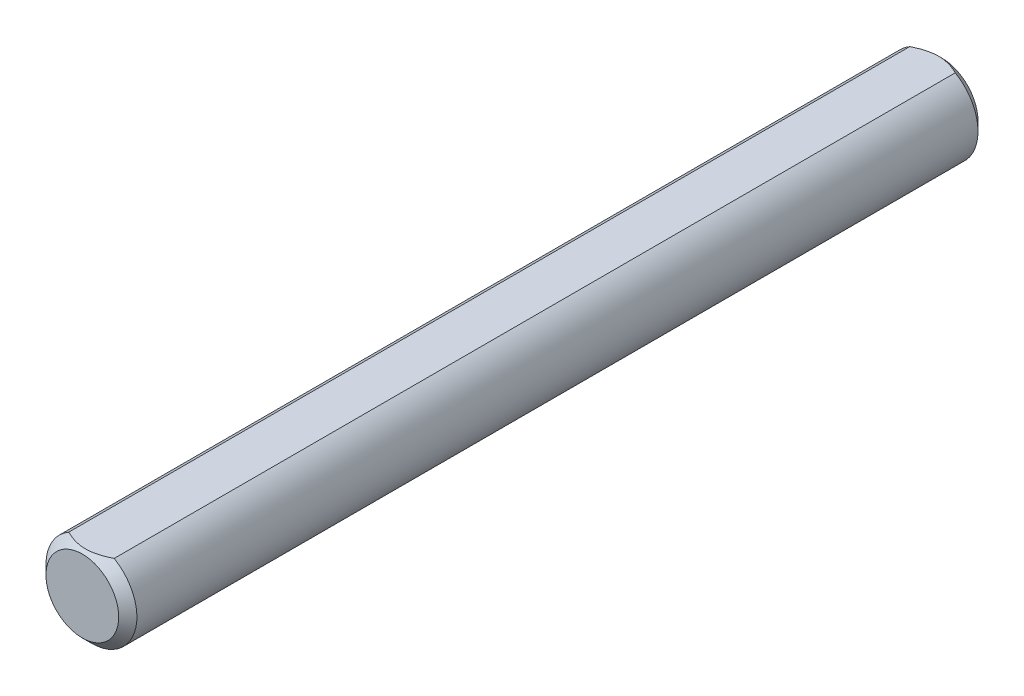
ISO-10303-21;
HEADER;
FILE_DESCRIPTION(('STEP AP214'),'2;1');
FILE_NAME('part.step','',(''),(''),'','','');
FILE_SCHEMA(('AUTOMOTIVE_DESIGN { 1 0 10303 214 1 1 1 1 }'));
ENDSEC;
DATA;
#1=APPLICATION_CONTEXT('core data for automotive mechanical design processes');
#2=APPLICATION_PROTOCOL_DEFINITION('international standard','automotive_design',2000,#1);
#3=PRODUCT_CONTEXT('',#1,'mechanical');
#4=PRODUCT('Part','Part','',(#3));
#5=PRODUCT_RELATED_PRODUCT_CATEGORY('part','',(#4));
#6=PRODUCT_DEFINITION_FORMATION('','',#4);
#7=PRODUCT_DEFINITION_CONTEXT('part definition',#1,'design');
#8=PRODUCT_DEFINITION('design','',#6,#7);
#9=PRODUCT_DEFINITION_SHAPE('','',#8);
#10=(LENGTH_UNIT() NAMED_UNIT(*) SI_UNIT(.MILLI.,.METRE.));
#11=(NAMED_UNIT(*) PLANE_ANGLE_UNIT() SI_UNIT($,.RADIAN.));
#12=(NAMED_UNIT(*) SI_UNIT($,.STERADIAN.) SOLID_ANGLE_UNIT());
#13=UNCERTAINTY_MEASURE_WITH_UNIT(LENGTH_MEASURE(1.E-05),#10,'distance_accuracy_value','');
#14=(GEOMETRIC_REPRESENTATION_CONTEXT(3) GLOBAL_UNCERTAINTY_ASSIGNED_CONTEXT((#13)) GLOBAL_UNIT_ASSIGNED_CONTEXT((#10,
#11,#12)) REPRESENTATION_CONTEXT('',''));
#15=CARTESIAN_POINT('',(0.,0.,0.));
#16=DIRECTION('',(0.,0.,1.));
#17=DIRECTION('',(1.,0.,0.));
#18=AXIS2_PLACEMENT_3D('',#15,#16,#17);
#19=CARTESIAN_POINT('',(0.,0.,30.));
#20=DIRECTION('',(0.,0.,-1.));
#21=DIRECTION('',(-1.,0.,0.));
#22=AXIS2_PLACEMENT_3D('',#19,#20,#21);
#23=CYLINDRICAL_SURFACE('',#22,3.175);
#24=CARTESIAN_POINT('',(0.,0.,29.365));
#25=DIRECTION('',(0.,0.,1.));
#26=DIRECTION('',(1.,0.,0.));
#27=AXIS2_PLACEMENT_3D('',#24,#25,#26);
#28=CIRCLE('',#27,3.175);
#29=CARTESIAN_POINT('',(1.5875,2.74963065701559,29.365));
#30=VERTEX_POINT('',#29);
#31=CARTESIAN_POINT('',(-1.5875,2.74963065701559,29.365));
#32=VERTEX_POINT('',#31);
#33=EDGE_CURVE('E76',#30,#32,#28,.F.);
#34=ORIENTED_EDGE('',*,*,#33,.T.);
#35=DIRECTION('',(0.,0.,1.));
#36=VECTOR('',#35,1.);
#37=CARTESIAN_POINT('',(-1.5875,2.74963065701559,-30.));
#38=LINE('',#37,#36);
#39=CARTESIAN_POINT('',(-1.5875,2.74963065701559,-29.365));
#40=VERTEX_POINT('',#39);
#41=EDGE_CURVE('E54',#40,#32,#38,.T.);
#42=ORIENTED_EDGE('',*,*,#41,.F.);
#43=CARTESIAN_POINT('',(0.,0.,-29.365));
#44=DIRECTION('',(0.,0.,1.));
#45=DIRECTION('',(1.,0.,0.));
#46=AXIS2_PLACEMENT_3D('',#43,#44,#45);
#47=CIRCLE('',#46,3.175);
#48=CARTESIAN_POINT('',(1.5875,2.74963065701559,-29.365));
#49=VERTEX_POINT('',#48);
#50=EDGE_CURVE('E75',#40,#49,#47,.T.);
#51=ORIENTED_EDGE('',*,*,#50,.T.);
#52=DIRECTION('',(0.,0.,1.));
#53=VECTOR('',#52,1.);
#54=CARTESIAN_POINT('',(1.5875,2.74963065701559,-30.));
#55=LINE('',#54,#53);
#56=EDGE_CURVE('E64',#49,#30,#55,.T.);
#57=ORIENTED_EDGE('',*,*,#56,.T.);
#58=EDGE_LOOP('',(#34,#42,#51,#57));
#59=FACE_BOUND('',#58,.T.);
#60=ADVANCED_FACE('F35',(#59),#23,.T.);
#61=CARTESIAN_POINT('',(0.,0.,30.));
#62=DIRECTION('',(0.,0.,1.));
#63=DIRECTION('',(1.,0.,0.));
#64=AXIS2_PLACEMENT_3D('',#61,#62,#63);
#65=PLANE('',#64);
#66=CARTESIAN_POINT('',(0.,0.,30.));
#67=DIRECTION('',(0.,0.,1.));
#68=DIRECTION('',(1.,0.,0.));
#69=AXIS2_PLACEMENT_3D('',#66,#67,#68);
#70=CIRCLE('',#69,2.54);
#71=CARTESIAN_POINT('',(2.54,0.,30.));
#72=VERTEX_POINT('',#71);
#73=EDGE_CURVE('E48',#72,#72,#70,.T.);
#74=ORIENTED_EDGE('',*,*,#73,.T.);
#75=EDGE_LOOP('',(#74));
#76=FACE_BOUND('',#75,.T.);
#77=ADVANCED_FACE('F86',(#76),#65,.T.);
#78=CARTESIAN_POINT('',(0.,0.,-30.));
#79=DIRECTION('',(0.,0.,1.));
#80=DIRECTION('',(1.,0.,0.));
#81=AXIS2_PLACEMENT_3D('',#78,#79,#80);
#82=PLANE('',#81);
#83=CARTESIAN_POINT('',(0.,0.,-30.));
#84=DIRECTION('',(0.,0.,1.));
#85=DIRECTION('',(1.,0.,0.));
#86=AXIS2_PLACEMENT_3D('',#83,#84,#85);
#87=CIRCLE('',#86,2.54);
#88=CARTESIAN_POINT('',(2.54,0.,-30.));
#89=VERTEX_POINT('',#88);
#90=EDGE_CURVE('E78',#89,#89,#87,.F.);
#91=ORIENTED_EDGE('',*,*,#90,.T.);
#92=EDGE_LOOP('',(#91));
#93=FACE_BOUND('',#92,.T.);
#94=ADVANCED_FACE('F94',(#93),#82,.F.);
#95=CARTESIAN_POINT('',(0.,0.,-29.365));
#96=DIRECTION('',(0.,0.,1.));
#97=DIRECTION('',(1.,0.,0.));
#98=AXIS2_PLACEMENT_3D('',#95,#96,#97);
#99=CONICAL_SURFACE('',#98,3.175,0.785398163397457);
#100=CARTESIAN_POINT('',(-3.22896135223732,2.74963065701559,-28.2989317189838));
#101=CARTESIAN_POINT('',(-3.15061649550107,2.74963065701559,-28.358566524546));
#102=CARTESIAN_POINT('',(-3.07184009651266,2.74963065701559,-28.417643482025));
#103=CARTESIAN_POINT('',(-2.9132513056882,2.74963065701559,-28.5344297176183));
#104=CARTESIAN_POINT('',(-2.83343866506296,2.74963065701559,-28.5921386575258));
#105=CARTESIAN_POINT('',(-2.67202062852748,2.74963065701559,-28.7063475478051));
#106=CARTESIAN_POINT('',(-2.5904061397043,2.74963065701559,-28.7628346895372));
#107=CARTESIAN_POINT('',(-2.42580311622165,2.74963065701559,-28.8737635143344));
#108=CARTESIAN_POINT('',(-2.34281467809336,2.74963065701559,-28.9282053402285));
#109=CARTESIAN_POINT('',(-2.1702144778723,2.74963065701559,-29.0377738711657));
#110=CARTESIAN_POINT('',(-2.08050398524193,2.74963065701559,-29.0927458353402));
#111=CARTESIAN_POINT('',(-1.89900904678692,2.74963065701559,-29.1991469931979));
#112=CARTESIAN_POINT('',(-1.80722487525635,2.74963065701559,-29.2505766518349));
#113=CARTESIAN_POINT('',(-1.6215376036893,2.74963065701559,-29.3488148050514));
#114=CARTESIAN_POINT('',(-1.52764140922494,2.74963065701559,-29.3956362501767));
#115=CARTESIAN_POINT('',(-1.337247065721,2.74963065701559,-29.4836008153407));
#116=CARTESIAN_POINT('',(-1.24075014112708,2.74963065701559,-29.5247465535942));
#117=CARTESIAN_POINT('',(-1.05364742760748,2.74963065701559,-29.5965564372305));
#118=CARTESIAN_POINT('',(-0.963276425588634,2.74963065701559,-29.6278260439733));
#119=CARTESIAN_POINT('',(-0.780303735161095,2.74963065701559,-29.6831231873505));
#120=CARTESIAN_POINT('',(-0.687701898779452,2.74963065701559,-29.7071502421446));
#121=CARTESIAN_POINT('',(-0.502391431282838,2.74963065701559,-29.7462882908411));
#122=CARTESIAN_POINT('',(-0.409716445146741,2.74963065701559,-29.7615559547489));
#123=CARTESIAN_POINT('',(-0.22330633068525,2.74963065701559,-29.7828688420294));
#124=CARTESIAN_POINT('',(-0.12957140343735,2.74963065701559,-29.7889157860141));
#125=CARTESIAN_POINT('',(0.0543357559016972,2.74963065701559,-29.7913094852485));
#126=CARTESIAN_POINT('',(0.144503242552387,2.74963065701559,-29.7880280862278));
#127=CARTESIAN_POINT('',(0.324095543573433,2.74963065701559,-29.7727817719638));
#128=CARTESIAN_POINT('',(0.413520286896887,2.74963065701559,-29.7608160354814));
#129=CARTESIAN_POINT('',(0.592496066024094,2.74963065701559,-29.7286615235361));
#130=CARTESIAN_POINT('',(0.68202117737904,2.74963065701559,-29.7083305801752));
#131=CARTESIAN_POINT('',(0.859103373963848,2.74963065701559,-29.660545197954));
#132=CARTESIAN_POINT('',(0.946660601088809,2.74963065701559,-29.6330912745013));
#133=CARTESIAN_POINT('',(1.21954622680467,2.74963065701559,-29.5371294821897));
#134=CARTESIAN_POINT('',(1.40108594012671,2.74963065701559,-29.4578094527363));
#135=CARTESIAN_POINT('',(1.66675889489866,2.74963065701559,-29.3255539852257));
#136=CARTESIAN_POINT('',(1.75437488385023,2.74963065701559,-29.2791526611238));
#137=CARTESIAN_POINT('',(1.92761951465608,2.74963065701559,-29.1827692377677));
#138=CARTESIAN_POINT('',(2.01324850705464,2.74963065701559,-29.1327877765756));
#139=CARTESIAN_POINT('',(2.17855184285745,2.74963065701559,-29.0325138433061));
#140=CARTESIAN_POINT('',(2.2583109724881,2.74963065701559,-28.9823595590396));
#141=CARTESIAN_POINT('',(2.41646118640008,2.74963065701559,-28.8799282177625));
#142=CARTESIAN_POINT('',(2.49485216688189,2.74963065701559,-28.8276510006805));
#143=CARTESIAN_POINT('',(2.64980987258641,2.74963065701559,-28.7217831250554));
#144=CARTESIAN_POINT('',(2.72638621983971,2.74963065701559,-28.6682064917738));
#145=CARTESIAN_POINT('',(2.8784904496918,2.74963065701559,-28.5596270900168));
#146=CARTESIAN_POINT('',(2.95401861519275,2.74963065701559,-28.504624718309));
#147=CARTESIAN_POINT('',(3.02910770969637,2.74963065701559,-28.4490389555825));
#148=B_SPLINE_CURVE_WITH_KNOTS('',3,(#100,#101,#102,#103,#104,#105,#106,#107,#108,#109,#110,
#111,#112,#113,#114,#115,#116,#117,#118,#119,#120,#121,#122,#123,#124,#125,#126,#127,#128,#129,
#130,#131,#132,#133,#134,#135,#136,#137,#138,#139,#140,#141,#142,#143,#144,#145,#146,#147),
.UNSPECIFIED.,.F.,.F.,(4,2,2,2,2,2,2,2,2,2,2,2,2,2,2,2,2,2,2,2,2,2,2,4),(0.,0.295383449271208,
0.59083917849879,0.888580871622952,1.1863017339907,1.50187785569756,1.81741247644347,
2.13203338294822,2.44650866534176,2.73314264689636,3.01979569373834,3.30114758261626,
3.58244696402028,3.85269226293496,4.1229631210719,4.39803055604401,4.67307809311875,
5.26557071241318,5.56297998480389,5.86033638333476,6.14295523590889,6.42559543796936,
6.70595195130131,6.98623126477279),.UNSPECIFIED.);
#149=EDGE_CURVE('E59',#49,#40,#148,.F.);
#150=ORIENTED_EDGE('',*,*,#149,.F.);
#151=ORIENTED_EDGE('',*,*,#50,.F.);
#152=EDGE_LOOP('',(#150,#151));
#153=FACE_BOUND('',#152,.T.);
#154=ORIENTED_EDGE('',*,*,#90,.F.);
#155=EDGE_LOOP('',(#154));
#156=FACE_BOUND('',#155,.T.);
#157=ADVANCED_FACE('F73',(#153,#156),#99,.T.);
#158=CARTESIAN_POINT('',(0.,0.,30.));
#159=DIRECTION('',(0.,0.,-1.));
#160=DIRECTION('',(-1.,0.,0.));
#161=AXIS2_PLACEMENT_3D('',#158,#159,#160);
#162=CONICAL_SURFACE('',#161,2.54,0.785398163397443);
#163=CARTESIAN_POINT('',(-3.22896135223728,2.74963065701559,28.2989317189837));
#164=CARTESIAN_POINT('',(-3.15061649550103,2.74963065701559,28.358566524546));
#165=CARTESIAN_POINT('',(-3.07184009651262,2.74963065701559,28.417643482025));
#166=CARTESIAN_POINT('',(-2.91325130568817,2.74963065701559,28.5344297176183));
#167=CARTESIAN_POINT('',(-2.83343866506293,2.74963065701559,28.5921386575258));
#168=CARTESIAN_POINT('',(-2.67202062852745,2.74963065701559,28.7063475478051));
#169=CARTESIAN_POINT('',(-2.59040613970427,2.74963065701559,28.7628346895372));
#170=CARTESIAN_POINT('',(-2.42580311622162,2.74963065701559,28.8737635143344));
#171=CARTESIAN_POINT('',(-2.34281467809334,2.74963065701559,28.9282053402285));
#172=CARTESIAN_POINT('',(-2.17021447787228,2.74963065701559,29.0377738711656));
#173=CARTESIAN_POINT('',(-2.08050398524192,2.74963065701559,29.0927458353402));
#174=CARTESIAN_POINT('',(-1.8990090467869,2.74963065701559,29.1991469931979));
#175=CARTESIAN_POINT('',(-1.80722487525634,2.74963065701559,29.2505766518349));
#176=CARTESIAN_POINT('',(-1.62153760368929,2.74963065701559,29.3488148050514));
#177=CARTESIAN_POINT('',(-1.52764140922493,2.74963065701559,29.3956362501767));
#178=CARTESIAN_POINT('',(-1.33724706572099,2.74963065701559,29.4836008153407));
#179=CARTESIAN_POINT('',(-1.24075014112707,2.74963065701559,29.5247465535942));
#180=CARTESIAN_POINT('',(-1.05364742760748,2.74963065701559,29.5965564372305));
#181=CARTESIAN_POINT('',(-0.963276425588638,2.74963065701559,29.6278260439733));
#182=CARTESIAN_POINT('',(-0.780303735161105,2.74963065701559,29.6831231873505));
#183=CARTESIAN_POINT('',(-0.687701898779464,2.74963065701559,29.7071502421446));
#184=CARTESIAN_POINT('',(-0.502391431282856,2.74963065701559,29.7462882908411));
#185=CARTESIAN_POINT('',(-0.409716445146761,2.74963065701559,29.7615559547489));
#186=CARTESIAN_POINT('',(-0.223306330685275,2.74963065701559,29.7828688420294));
#187=CARTESIAN_POINT('',(-0.129571403437378,2.74963065701559,29.7889157860141));
#188=CARTESIAN_POINT('',(0.0543357559016647,2.74963065701559,29.7913094852485));
#189=CARTESIAN_POINT('',(0.144503242552353,2.74963065701559,29.7880280862278));
#190=CARTESIAN_POINT('',(0.324095543573395,2.74963065701559,29.7727817719638));
#191=CARTESIAN_POINT('',(0.413520286896848,2.74963065701559,29.7608160354814));
#192=CARTESIAN_POINT('',(0.592496066024051,2.74963065701559,29.7286615235361));
#193=CARTESIAN_POINT('',(0.682021177378996,2.74963065701559,29.7083305801752));
#194=CARTESIAN_POINT('',(0.8591033739638,2.74963065701559,29.660545197954));
#195=CARTESIAN_POINT('',(0.94666060108876,2.74963065701559,29.6330912745013));
#196=CARTESIAN_POINT('',(1.2195462268046,2.74963065701559,29.5371294821897));
#197=CARTESIAN_POINT('',(1.40108594012663,2.74963065701559,29.4578094527363));
#198=CARTESIAN_POINT('',(1.66675889489856,2.74963065701559,29.3255539852257));
#199=CARTESIAN_POINT('',(1.75437488385012,2.74963065701559,29.2791526611238));
#200=CARTESIAN_POINT('',(1.92761951465596,2.74963065701559,29.1827692377677));
#201=CARTESIAN_POINT('',(2.01324850705451,2.74963065701559,29.1327877765756));
#202=CARTESIAN_POINT('',(2.17855184285731,2.74963065701559,29.0325138433061));
#203=CARTESIAN_POINT('',(2.25831097248796,2.74963065701559,28.9823595590396));
#204=CARTESIAN_POINT('',(2.41646118639992,2.74963065701559,28.8799282177626));
#205=CARTESIAN_POINT('',(2.49485216688172,2.74963065701559,28.8276510006805));
#206=CARTESIAN_POINT('',(2.64980987258623,2.74963065701559,28.7217831250554));
#207=CARTESIAN_POINT('',(2.72638621983953,2.74963065701559,28.6682064917739));
#208=CARTESIAN_POINT('',(2.87849044969161,2.74963065701559,28.5596270900169));
#209=CARTESIAN_POINT('',(2.95401861519256,2.74963065701559,28.5046247183091));
#210=CARTESIAN_POINT('',(3.02910770969617,2.74963065701559,28.4490389555826));
#211=B_SPLINE_CURVE_WITH_KNOTS('',3,(#163,#164,#165,#166,#167,#168,#169,#170,#171,#172,#173,
#174,#175,#176,#177,#178,#179,#180,#181,#182,#183,#184,#185,#186,#187,#188,#189,#190,#191,#192,
#193,#194,#195,#196,#197,#198,#199,#200,#201,#202,#203,#204,#205,#206,#207,#208,#209,#210),
.UNSPECIFIED.,.F.,.F.,(4,2,2,2,2,2,2,2,2,2,2,2,2,2,2,2,2,2,2,2,2,2,2,4),(0.,0.295383449271206,
0.590839178498785,0.888580871622945,1.18630173399069,1.50187785569755,1.81741247644345,
2.1320333829482,2.44650866534174,2.73314264689633,3.0197956937383,3.30114758261621,
3.58244696402022,3.8526922629349,4.12296312107184,4.39803055604393,4.67307809311867,
5.26557071241305,5.56297998480373,5.86033638333458,6.14295523590869,6.42559543796914,
6.70595195130107,6.98623126477253),.UNSPECIFIED.);
#212=EDGE_CURVE('E11',#32,#30,#211,.T.);
#213=ORIENTED_EDGE('',*,*,#212,.F.);
#214=ORIENTED_EDGE('',*,*,#33,.F.);
#215=EDGE_LOOP('',(#213,#214));
#216=FACE_BOUND('',#215,.T.);
#217=ORIENTED_EDGE('',*,*,#73,.F.);
#218=EDGE_LOOP('',(#217));
#219=FACE_BOUND('',#218,.T.);
#220=ADVANCED_FACE('F37',(#216,#219),#162,.T.);
#221=CARTESIAN_POINT('',(-1.5875,2.74963065701559,-30.));
#222=DIRECTION('',(0.,-1.,0.));
#223=DIRECTION('',(0.,0.,-1.));
#224=AXIS2_PLACEMENT_3D('',#221,#222,#223);
#225=PLANE('',#224);
#226=ORIENTED_EDGE('',*,*,#149,.T.);
#227=ORIENTED_EDGE('',*,*,#41,.T.);
#228=ORIENTED_EDGE('',*,*,#212,.T.);
#229=ORIENTED_EDGE('',*,*,#56,.F.);
#230=EDGE_LOOP('',(#226,#227,#228,#229));
#231=FACE_BOUND('',#230,.T.);
#232=ADVANCED_FACE('F65',(#231),#225,.F.);
#233=CLOSED_SHELL('',(#60,#77,#94,#157,#220,#232));
#234=MANIFOLD_SOLID_BREP('B2',#233);
#235=ADVANCED_BREP_SHAPE_REPRESENTATION('',(#18,#234),#14);
#236=SHAPE_DEFINITION_REPRESENTATION(#9,#235);
ENDSEC;
END-ISO-10303-21;
